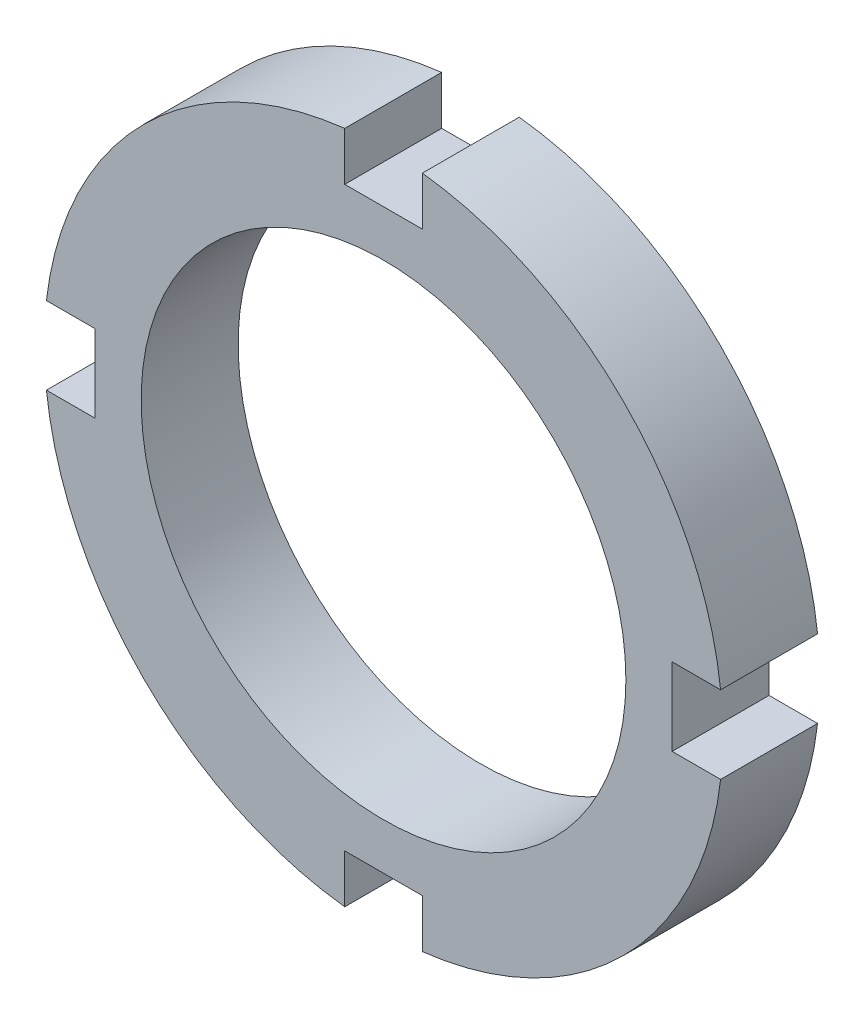
ISO-10303-21;
HEADER;
FILE_DESCRIPTION(('STEP AP214'),'2;1');
FILE_NAME('part.step','',(''),(''),'','','');
FILE_SCHEMA(('AUTOMOTIVE_DESIGN { 1 0 10303 214 1 1 1 1 }'));
ENDSEC;
DATA;
#1=APPLICATION_CONTEXT('core data for automotive mechanical design processes');
#2=APPLICATION_PROTOCOL_DEFINITION('international standard','automotive_design',2000,#1);
#3=PRODUCT_CONTEXT('',#1,'mechanical');
#4=PRODUCT('Part','Part','',(#3));
#5=PRODUCT_RELATED_PRODUCT_CATEGORY('part','',(#4));
#6=PRODUCT_DEFINITION_FORMATION('','',#4);
#7=PRODUCT_DEFINITION_CONTEXT('part definition',#1,'design');
#8=PRODUCT_DEFINITION('design','',#6,#7);
#9=PRODUCT_DEFINITION_SHAPE('','',#8);
#10=(LENGTH_UNIT() NAMED_UNIT(*) SI_UNIT(.MILLI.,.METRE.));
#11=(NAMED_UNIT(*) PLANE_ANGLE_UNIT() SI_UNIT($,.RADIAN.));
#12=(NAMED_UNIT(*) SI_UNIT($,.STERADIAN.) SOLID_ANGLE_UNIT());
#13=UNCERTAINTY_MEASURE_WITH_UNIT(LENGTH_MEASURE(1.E-05),#10,'distance_accuracy_value','');
#14=(GEOMETRIC_REPRESENTATION_CONTEXT(3) GLOBAL_UNCERTAINTY_ASSIGNED_CONTEXT((#13)) GLOBAL_UNIT_ASSIGNED_CONTEXT((#10,
#11,#12)) REPRESENTATION_CONTEXT('',''));
#15=CARTESIAN_POINT('',(0.,0.,0.));
#16=DIRECTION('',(0.,0.,1.));
#17=DIRECTION('',(1.,0.,0.));
#18=AXIS2_PLACEMENT_3D('',#15,#16,#17);
#19=CARTESIAN_POINT('',(0.,0.,5.));
#20=DIRECTION('',(0.,0.,1.));
#21=DIRECTION('',(1.,0.,0.));
#22=AXIS2_PLACEMENT_3D('',#19,#20,#21);
#23=PLANE('',#22);
#24=CARTESIAN_POINT('',(0.,0.,5.));
#25=DIRECTION('',(0.,0.,1.));
#26=DIRECTION('',(1.,0.,0.));
#27=AXIS2_PLACEMENT_3D('',#24,#25,#26);
#28=CIRCLE('',#27,17.5);
#29=CARTESIAN_POINT('',(17.3853386507137,1.99999999999994,5.));
#30=VERTEX_POINT('',#29);
#31=CARTESIAN_POINT('',(2.,17.3853386507137,5.));
#32=VERTEX_POINT('',#31);
#33=EDGE_CURVE('E239',#30,#32,#28,.T.);
#34=ORIENTED_EDGE('',*,*,#33,.T.);
#35=DIRECTION('',(0.,-1.,0.));
#36=VECTOR('',#35,1.);
#37=CARTESIAN_POINT('',(2.,17.3853386507137,5.));
#38=LINE('',#37,#36);
#39=CARTESIAN_POINT('',(2.,14.8853386507137,5.));
#40=VERTEX_POINT('',#39);
#41=EDGE_CURVE('E126',#32,#40,#38,.T.);
#42=ORIENTED_EDGE('',*,*,#41,.T.);
#43=DIRECTION('',(-1.,0.,0.));
#44=VECTOR('',#43,1.);
#45=CARTESIAN_POINT('',(2.,14.8853386507137,5.));
#46=LINE('',#45,#44);
#47=CARTESIAN_POINT('',(-2.,14.8853386507137,5.));
#48=VERTEX_POINT('',#47);
#49=EDGE_CURVE('E293',#40,#48,#46,.T.);
#50=ORIENTED_EDGE('',*,*,#49,.T.);
#51=DIRECTION('',(0.,1.,0.));
#52=VECTOR('',#51,1.);
#53=CARTESIAN_POINT('',(-2.,17.3853386507137,5.));
#54=LINE('',#53,#52);
#55=CARTESIAN_POINT('',(-2.,17.3853386507137,5.));
#56=VERTEX_POINT('',#55);
#57=EDGE_CURVE('E313',#48,#56,#54,.T.);
#58=ORIENTED_EDGE('',*,*,#57,.T.);
#59=CARTESIAN_POINT('',(0.,0.,5.));
#60=DIRECTION('',(0.,0.,1.));
#61=DIRECTION('',(1.,0.,0.));
#62=AXIS2_PLACEMENT_3D('',#59,#60,#61);
#63=CIRCLE('',#62,17.5);
#64=CARTESIAN_POINT('',(-17.3853386507137,2.00000000000018,5.));
#65=VERTEX_POINT('',#64);
#66=EDGE_CURVE('E309',#56,#65,#63,.T.);
#67=ORIENTED_EDGE('',*,*,#66,.T.);
#68=DIRECTION('',(1.,0.,0.));
#69=VECTOR('',#68,1.);
#70=CARTESIAN_POINT('',(-17.3853386507137,2.00000000000018,5.));
#71=LINE('',#70,#69);
#72=CARTESIAN_POINT('',(-14.8853386507137,2.00000000000016,5.));
#73=VERTEX_POINT('',#72);
#74=EDGE_CURVE('E312',#65,#73,#71,.T.);
#75=ORIENTED_EDGE('',*,*,#74,.T.);
#76=DIRECTION('',(0.,-1.,0.));
#77=VECTOR('',#76,1.);
#78=CARTESIAN_POINT('',(-14.8853386507137,2.00000000000016,5.));
#79=LINE('',#78,#77);
#80=CARTESIAN_POINT('',(-14.8853386507137,-1.99999999999984,5.));
#81=VERTEX_POINT('',#80);
#82=EDGE_CURVE('E318',#73,#81,#79,.T.);
#83=ORIENTED_EDGE('',*,*,#82,.T.);
#84=DIRECTION('',(-1.,0.,0.));
#85=VECTOR('',#84,1.);
#86=CARTESIAN_POINT('',(-17.3853386507137,-1.99999999999982,5.));
#87=LINE('',#86,#85);
#88=CARTESIAN_POINT('',(-17.3853386507137,-1.99999999999982,5.));
#89=VERTEX_POINT('',#88);
#90=EDGE_CURVE('E325',#81,#89,#87,.T.);
#91=ORIENTED_EDGE('',*,*,#90,.T.);
#92=CARTESIAN_POINT('',(0.,0.,5.));
#93=DIRECTION('',(0.,0.,1.));
#94=DIRECTION('',(1.,0.,0.));
#95=AXIS2_PLACEMENT_3D('',#92,#93,#94);
#96=CIRCLE('',#95,17.5);
#97=CARTESIAN_POINT('',(-2.00000000000013,-17.3853386507137,5.));
#98=VERTEX_POINT('',#97);
#99=EDGE_CURVE('E328',#89,#98,#96,.T.);
#100=ORIENTED_EDGE('',*,*,#99,.T.);
#101=DIRECTION('',(0.,1.,0.));
#102=VECTOR('',#101,1.);
#103=CARTESIAN_POINT('',(-2.00000000000012,-17.3853386507137,5.));
#104=LINE('',#103,#102);
#105=CARTESIAN_POINT('',(-2.0000000000001,-14.8853386507137,5.));
#106=VERTEX_POINT('',#105);
#107=EDGE_CURVE('E331',#98,#106,#104,.T.);
#108=ORIENTED_EDGE('',*,*,#107,.T.);
#109=DIRECTION('',(1.,0.,0.));
#110=VECTOR('',#109,1.);
#111=CARTESIAN_POINT('',(-2.0000000000001,-14.8853386507137,5.));
#112=LINE('',#111,#110);
#113=CARTESIAN_POINT('',(1.9999999999999,-14.8853386507137,5.));
#114=VERTEX_POINT('',#113);
#115=EDGE_CURVE('E334',#106,#114,#112,.T.);
#116=ORIENTED_EDGE('',*,*,#115,.T.);
#117=DIRECTION('',(0.,-1.,0.));
#118=VECTOR('',#117,1.);
#119=CARTESIAN_POINT('',(1.99999999999988,-17.3853386507137,5.));
#120=LINE('',#119,#118);
#121=CARTESIAN_POINT('',(1.99999999999988,-17.3853386507137,5.));
#122=VERTEX_POINT('',#121);
#123=EDGE_CURVE('E337',#114,#122,#120,.T.);
#124=ORIENTED_EDGE('',*,*,#123,.T.);
#125=CARTESIAN_POINT('',(0.,0.,5.));
#126=DIRECTION('',(0.,0.,1.));
#127=DIRECTION('',(1.,0.,0.));
#128=AXIS2_PLACEMENT_3D('',#125,#126,#127);
#129=CIRCLE('',#128,17.5);
#130=CARTESIAN_POINT('',(17.3853386507137,-2.00000000000007,5.));
#131=VERTEX_POINT('',#130);
#132=EDGE_CURVE('E169',#122,#131,#129,.T.);
#133=ORIENTED_EDGE('',*,*,#132,.T.);
#134=DIRECTION('',(-1.,0.,0.));
#135=VECTOR('',#134,1.);
#136=CARTESIAN_POINT('',(17.3853386507137,-2.00000000000006,5.));
#137=LINE('',#136,#135);
#138=CARTESIAN_POINT('',(14.8853386507137,-2.00000000000005,5.));
#139=VERTEX_POINT('',#138);
#140=EDGE_CURVE('E163',#131,#139,#137,.T.);
#141=ORIENTED_EDGE('',*,*,#140,.T.);
#142=DIRECTION('',(0.,1.,0.));
#143=VECTOR('',#142,1.);
#144=CARTESIAN_POINT('',(14.8853386507137,-2.00000000000005,5.));
#145=LINE('',#144,#143);
#146=CARTESIAN_POINT('',(14.8853386507137,1.99999999999995,5.));
#147=VERTEX_POINT('',#146);
#148=EDGE_CURVE('E167',#139,#147,#145,.T.);
#149=ORIENTED_EDGE('',*,*,#148,.T.);
#150=DIRECTION('',(1.,0.,0.));
#151=VECTOR('',#150,1.);
#152=CARTESIAN_POINT('',(17.3853386507137,1.99999999999994,5.));
#153=LINE('',#152,#151);
#154=EDGE_CURVE('E59',#147,#30,#153,.T.);
#155=ORIENTED_EDGE('',*,*,#154,.T.);
#156=EDGE_LOOP('',(#34,#42,#50,#58,#67,#75,#83,#91,#100,#108,#116,#124,#133,#141,#149,#155));
#157=FACE_BOUND('',#156,.T.);
#158=CARTESIAN_POINT('',(0.,0.,5.));
#159=DIRECTION('',(0.,0.,1.));
#160=DIRECTION('',(1.,0.,0.));
#161=AXIS2_PLACEMENT_3D('',#158,#159,#160);
#162=CIRCLE('',#161,12.5);
#163=CARTESIAN_POINT('',(12.5,0.,5.));
#164=VERTEX_POINT('',#163);
#165=EDGE_CURVE('E197',#164,#164,#162,.T.);
#166=ORIENTED_EDGE('',*,*,#165,.F.);
#167=EDGE_LOOP('',(#166));
#168=FACE_BOUND('',#167,.T.);
#169=ADVANCED_FACE('F41',(#157,#168),#23,.T.);
#170=CARTESIAN_POINT('',(0.,0.,0.));
#171=DIRECTION('',(0.,0.,1.));
#172=DIRECTION('',(1.,0.,0.));
#173=AXIS2_PLACEMENT_3D('',#170,#171,#172);
#174=PLANE('',#173);
#175=CARTESIAN_POINT('',(0.,0.,0.));
#176=DIRECTION('',(0.,0.,1.));
#177=DIRECTION('',(1.,0.,0.));
#178=AXIS2_PLACEMENT_3D('',#175,#176,#177);
#179=CIRCLE('',#178,17.5);
#180=CARTESIAN_POINT('',(17.3853386507137,1.99999999999994,0.));
#181=VERTEX_POINT('',#180);
#182=CARTESIAN_POINT('',(2.,17.3853386507137,0.));
#183=VERTEX_POINT('',#182);
#184=EDGE_CURVE('E192',#181,#183,#179,.T.);
#185=ORIENTED_EDGE('',*,*,#184,.F.);
#186=DIRECTION('',(1.,0.,0.));
#187=VECTOR('',#186,1.);
#188=CARTESIAN_POINT('',(17.3853386507137,1.99999999999994,0.));
#189=LINE('',#188,#187);
#190=CARTESIAN_POINT('',(14.8853386507137,1.99999999999995,0.));
#191=VERTEX_POINT('',#190);
#192=EDGE_CURVE('E118',#191,#181,#189,.T.);
#193=ORIENTED_EDGE('',*,*,#192,.F.);
#194=DIRECTION('',(0.,1.,0.));
#195=VECTOR('',#194,1.);
#196=CARTESIAN_POINT('',(14.8853386507137,-2.00000000000005,0.));
#197=LINE('',#196,#195);
#198=CARTESIAN_POINT('',(14.8853386507137,-2.00000000000005,0.));
#199=VERTEX_POINT('',#198);
#200=EDGE_CURVE('E112',#199,#191,#197,.T.);
#201=ORIENTED_EDGE('',*,*,#200,.F.);
#202=DIRECTION('',(-1.,0.,0.));
#203=VECTOR('',#202,1.);
#204=CARTESIAN_POINT('',(17.3853386507137,-2.00000000000006,0.));
#205=LINE('',#204,#203);
#206=CARTESIAN_POINT('',(17.3853386507137,-2.00000000000007,0.));
#207=VERTEX_POINT('',#206);
#208=EDGE_CURVE('E178',#207,#199,#205,.T.);
#209=ORIENTED_EDGE('',*,*,#208,.F.);
#210=CARTESIAN_POINT('',(0.,0.,0.));
#211=DIRECTION('',(0.,0.,1.));
#212=DIRECTION('',(1.,0.,0.));
#213=AXIS2_PLACEMENT_3D('',#210,#211,#212);
#214=CIRCLE('',#213,17.5);
#215=CARTESIAN_POINT('',(1.99999999999988,-17.3853386507137,0.));
#216=VERTEX_POINT('',#215);
#217=EDGE_CURVE('E230',#216,#207,#214,.T.);
#218=ORIENTED_EDGE('',*,*,#217,.F.);
#219=DIRECTION('',(0.,-1.,0.));
#220=VECTOR('',#219,1.);
#221=CARTESIAN_POINT('',(1.99999999999988,-17.3853386507137,0.));
#222=LINE('',#221,#220);
#223=CARTESIAN_POINT('',(1.9999999999999,-14.8853386507137,0.));
#224=VERTEX_POINT('',#223);
#225=EDGE_CURVE('E227',#224,#216,#222,.T.);
#226=ORIENTED_EDGE('',*,*,#225,.F.);
#227=DIRECTION('',(1.,0.,0.));
#228=VECTOR('',#227,1.);
#229=CARTESIAN_POINT('',(-2.0000000000001,-14.8853386507137,0.));
#230=LINE('',#229,#228);
#231=CARTESIAN_POINT('',(-2.0000000000001,-14.8853386507137,0.));
#232=VERTEX_POINT('',#231);
#233=EDGE_CURVE('E224',#232,#224,#230,.T.);
#234=ORIENTED_EDGE('',*,*,#233,.F.);
#235=DIRECTION('',(0.,1.,0.));
#236=VECTOR('',#235,1.);
#237=CARTESIAN_POINT('',(-2.00000000000012,-17.3853386507137,0.));
#238=LINE('',#237,#236);
#239=CARTESIAN_POINT('',(-2.00000000000013,-17.3853386507137,0.));
#240=VERTEX_POINT('',#239);
#241=EDGE_CURVE('E221',#240,#232,#238,.T.);
#242=ORIENTED_EDGE('',*,*,#241,.F.);
#243=CARTESIAN_POINT('',(0.,0.,0.));
#244=DIRECTION('',(0.,0.,1.));
#245=DIRECTION('',(1.,0.,0.));
#246=AXIS2_PLACEMENT_3D('',#243,#244,#245);
#247=CIRCLE('',#246,17.5);
#248=CARTESIAN_POINT('',(-17.3853386507137,-1.99999999999982,0.));
#249=VERTEX_POINT('',#248);
#250=EDGE_CURVE('E218',#249,#240,#247,.T.);
#251=ORIENTED_EDGE('',*,*,#250,.F.);
#252=DIRECTION('',(-1.,0.,0.));
#253=VECTOR('',#252,1.);
#254=CARTESIAN_POINT('',(-17.3853386507137,-1.99999999999982,0.));
#255=LINE('',#254,#253);
#256=CARTESIAN_POINT('',(-14.8853386507137,-1.99999999999984,0.));
#257=VERTEX_POINT('',#256);
#258=EDGE_CURVE('E215',#257,#249,#255,.T.);
#259=ORIENTED_EDGE('',*,*,#258,.F.);
#260=DIRECTION('',(0.,-1.,0.));
#261=VECTOR('',#260,1.);
#262=CARTESIAN_POINT('',(-14.8853386507137,2.00000000000016,0.));
#263=LINE('',#262,#261);
#264=CARTESIAN_POINT('',(-14.8853386507137,2.00000000000016,0.));
#265=VERTEX_POINT('',#264);
#266=EDGE_CURVE('E212',#265,#257,#263,.T.);
#267=ORIENTED_EDGE('',*,*,#266,.F.);
#268=DIRECTION('',(1.,0.,0.));
#269=VECTOR('',#268,1.);
#270=CARTESIAN_POINT('',(-17.3853386507137,2.00000000000018,0.));
#271=LINE('',#270,#269);
#272=CARTESIAN_POINT('',(-17.3853386507137,2.00000000000018,0.));
#273=VERTEX_POINT('',#272);
#274=EDGE_CURVE('E209',#273,#265,#271,.T.);
#275=ORIENTED_EDGE('',*,*,#274,.F.);
#276=CARTESIAN_POINT('',(0.,0.,0.));
#277=DIRECTION('',(0.,0.,1.));
#278=DIRECTION('',(1.,0.,0.));
#279=AXIS2_PLACEMENT_3D('',#276,#277,#278);
#280=CIRCLE('',#279,17.5);
#281=CARTESIAN_POINT('',(-2.,17.3853386507137,0.));
#282=VERTEX_POINT('',#281);
#283=EDGE_CURVE('E206',#282,#273,#280,.T.);
#284=ORIENTED_EDGE('',*,*,#283,.F.);
#285=DIRECTION('',(0.,1.,0.));
#286=VECTOR('',#285,1.);
#287=CARTESIAN_POINT('',(-2.,17.3853386507137,0.));
#288=LINE('',#287,#286);
#289=CARTESIAN_POINT('',(-2.,14.8853386507137,0.));
#290=VERTEX_POINT('',#289);
#291=EDGE_CURVE('E203',#290,#282,#288,.T.);
#292=ORIENTED_EDGE('',*,*,#291,.F.);
#293=DIRECTION('',(-1.,0.,0.));
#294=VECTOR('',#293,1.);
#295=CARTESIAN_POINT('',(2.,14.8853386507137,0.));
#296=LINE('',#295,#294);
#297=CARTESIAN_POINT('',(2.,14.8853386507137,0.));
#298=VERTEX_POINT('',#297);
#299=EDGE_CURVE('E200',#298,#290,#296,.T.);
#300=ORIENTED_EDGE('',*,*,#299,.F.);
#301=DIRECTION('',(0.,-1.,0.));
#302=VECTOR('',#301,1.);
#303=CARTESIAN_POINT('',(2.,17.3853386507137,0.));
#304=LINE('',#303,#302);
#305=EDGE_CURVE('E196',#183,#298,#304,.T.);
#306=ORIENTED_EDGE('',*,*,#305,.F.);
#307=EDGE_LOOP('',(#185,#193,#201,#209,#218,#226,#234,#242,#251,#259,#267,#275,#284,#292,#300,#306));
#308=FACE_BOUND('',#307,.T.);
#309=CARTESIAN_POINT('',(0.,0.,0.));
#310=DIRECTION('',(0.,0.,1.));
#311=DIRECTION('',(1.,0.,0.));
#312=AXIS2_PLACEMENT_3D('',#309,#310,#311);
#313=CIRCLE('',#312,12.5);
#314=CARTESIAN_POINT('',(12.5,0.,0.));
#315=VERTEX_POINT('',#314);
#316=EDGE_CURVE('E547',#315,#315,#313,.T.);
#317=ORIENTED_EDGE('',*,*,#316,.T.);
#318=EDGE_LOOP('',(#317));
#319=FACE_BOUND('',#318,.T.);
#320=ADVANCED_FACE('F297',(#308,#319),#174,.F.);
#321=CARTESIAN_POINT('',(0.,0.,5.));
#322=DIRECTION('',(0.,0.,-1.));
#323=DIRECTION('',(-1.,0.,0.));
#324=AXIS2_PLACEMENT_3D('',#321,#322,#323);
#325=CYLINDRICAL_SURFACE('',#324,17.5);
#326=ORIENTED_EDGE('',*,*,#184,.T.);
#327=DIRECTION('',(0.,0.,-1.));
#328=VECTOR('',#327,1.);
#329=CARTESIAN_POINT('',(2.,17.3853386507137,5.));
#330=LINE('',#329,#328);
#331=EDGE_CURVE('E11',#32,#183,#330,.T.);
#332=ORIENTED_EDGE('',*,*,#331,.F.);
#333=ORIENTED_EDGE('',*,*,#33,.F.);
#334=DIRECTION('',(0.,0.,-1.));
#335=VECTOR('',#334,1.);
#336=CARTESIAN_POINT('',(17.3853386507137,1.99999999999994,5.));
#337=LINE('',#336,#335);
#338=EDGE_CURVE('E188',#30,#181,#337,.T.);
#339=ORIENTED_EDGE('',*,*,#338,.T.);
#340=EDGE_LOOP('',(#326,#332,#333,#339));
#341=FACE_BOUND('',#340,.T.);
#342=ADVANCED_FACE('F43',(#341),#325,.T.);
#343=CARTESIAN_POINT('',(2.,17.3853386507137,5.));
#344=DIRECTION('',(1.,0.,0.));
#345=DIRECTION('',(0.,1.,0.));
#346=AXIS2_PLACEMENT_3D('',#343,#344,#345);
#347=PLANE('',#346);
#348=ORIENTED_EDGE('',*,*,#305,.T.);
#349=DIRECTION('',(0.,0.,-1.));
#350=VECTOR('',#349,1.);
#351=CARTESIAN_POINT('',(2.,14.8853386507137,5.));
#352=LINE('',#351,#350);
#353=EDGE_CURVE('E51',#40,#298,#352,.T.);
#354=ORIENTED_EDGE('',*,*,#353,.F.);
#355=ORIENTED_EDGE('',*,*,#41,.F.);
#356=ORIENTED_EDGE('',*,*,#331,.T.);
#357=EDGE_LOOP('',(#348,#354,#355,#356));
#358=FACE_BOUND('',#357,.T.);
#359=ADVANCED_FACE('F382',(#358),#347,.F.);
#360=CARTESIAN_POINT('',(2.,14.8853386507137,5.));
#361=DIRECTION('',(0.,-1.,0.));
#362=DIRECTION('',(0.,0.,-1.));
#363=AXIS2_PLACEMENT_3D('',#360,#361,#362);
#364=PLANE('',#363);
#365=ORIENTED_EDGE('',*,*,#299,.T.);
#366=DIRECTION('',(0.,0.,-1.));
#367=VECTOR('',#366,1.);
#368=CARTESIAN_POINT('',(-2.,14.8853386507137,5.));
#369=LINE('',#368,#367);
#370=EDGE_CURVE('E282',#48,#290,#369,.T.);
#371=ORIENTED_EDGE('',*,*,#370,.F.);
#372=ORIENTED_EDGE('',*,*,#49,.F.);
#373=ORIENTED_EDGE('',*,*,#353,.T.);
#374=EDGE_LOOP('',(#365,#371,#372,#373));
#375=FACE_BOUND('',#374,.T.);
#376=ADVANCED_FACE('F291',(#375),#364,.F.);
#377=CARTESIAN_POINT('',(-2.,17.3853386507137,5.));
#378=DIRECTION('',(-1.,0.,0.));
#379=DIRECTION('',(0.,-1.,0.));
#380=AXIS2_PLACEMENT_3D('',#377,#378,#379);
#381=PLANE('',#380);
#382=ORIENTED_EDGE('',*,*,#291,.T.);
#383=DIRECTION('',(0.,0.,-1.));
#384=VECTOR('',#383,1.);
#385=CARTESIAN_POINT('',(-2.,17.3853386507137,5.));
#386=LINE('',#385,#384);
#387=EDGE_CURVE('E278',#56,#282,#386,.T.);
#388=ORIENTED_EDGE('',*,*,#387,.F.);
#389=ORIENTED_EDGE('',*,*,#57,.F.);
#390=ORIENTED_EDGE('',*,*,#370,.T.);
#391=EDGE_LOOP('',(#382,#388,#389,#390));
#392=FACE_BOUND('',#391,.T.);
#393=ADVANCED_FACE('F303',(#392),#381,.F.);
#394=CARTESIAN_POINT('',(0.,0.,5.));
#395=DIRECTION('',(0.,0.,-1.));
#396=DIRECTION('',(-1.,0.,0.));
#397=AXIS2_PLACEMENT_3D('',#394,#395,#396);
#398=CYLINDRICAL_SURFACE('',#397,17.5);
#399=ORIENTED_EDGE('',*,*,#283,.T.);
#400=DIRECTION('',(0.,0.,-1.));
#401=VECTOR('',#400,1.);
#402=CARTESIAN_POINT('',(-17.3853386507137,2.00000000000018,5.));
#403=LINE('',#402,#401);
#404=EDGE_CURVE('E274',#65,#273,#403,.T.);
#405=ORIENTED_EDGE('',*,*,#404,.F.);
#406=ORIENTED_EDGE('',*,*,#66,.F.);
#407=ORIENTED_EDGE('',*,*,#387,.T.);
#408=EDGE_LOOP('',(#399,#405,#406,#407));
#409=FACE_BOUND('',#408,.T.);
#410=ADVANCED_FACE('F307',(#409),#398,.T.);
#411=CARTESIAN_POINT('',(-17.3853386507137,2.00000000000018,5.));
#412=DIRECTION('',(0.,1.,0.));
#413=DIRECTION('',(-1.,0.,0.));
#414=AXIS2_PLACEMENT_3D('',#411,#412,#413);
#415=PLANE('',#414);
#416=ORIENTED_EDGE('',*,*,#274,.T.);
#417=DIRECTION('',(0.,0.,-1.));
#418=VECTOR('',#417,1.);
#419=CARTESIAN_POINT('',(-14.8853386507137,2.00000000000016,5.));
#420=LINE('',#419,#418);
#421=EDGE_CURVE('E270',#73,#265,#420,.T.);
#422=ORIENTED_EDGE('',*,*,#421,.F.);
#423=ORIENTED_EDGE('',*,*,#74,.F.);
#424=ORIENTED_EDGE('',*,*,#404,.T.);
#425=EDGE_LOOP('',(#416,#422,#423,#424));
#426=FACE_BOUND('',#425,.T.);
#427=ADVANCED_FACE('F395',(#426),#415,.F.);
#428=CARTESIAN_POINT('',(-14.8853386507137,2.00000000000016,5.));
#429=DIRECTION('',(1.,0.,0.));
#430=DIRECTION('',(0.,1.,0.));
#431=AXIS2_PLACEMENT_3D('',#428,#429,#430);
#432=PLANE('',#431);
#433=ORIENTED_EDGE('',*,*,#266,.T.);
#434=DIRECTION('',(0.,0.,-1.));
#435=VECTOR('',#434,1.);
#436=CARTESIAN_POINT('',(-14.8853386507137,-1.99999999999984,5.));
#437=LINE('',#436,#435);
#438=EDGE_CURVE('E266',#81,#257,#437,.T.);
#439=ORIENTED_EDGE('',*,*,#438,.F.);
#440=ORIENTED_EDGE('',*,*,#82,.F.);
#441=ORIENTED_EDGE('',*,*,#421,.T.);
#442=EDGE_LOOP('',(#433,#439,#440,#441));
#443=FACE_BOUND('',#442,.T.);
#444=ADVANCED_FACE('F398',(#443),#432,.F.);
#445=CARTESIAN_POINT('',(-17.3853386507137,-1.99999999999982,5.));
#446=DIRECTION('',(0.,-1.,0.));
#447=DIRECTION('',(1.,0.,0.));
#448=AXIS2_PLACEMENT_3D('',#445,#446,#447);
#449=PLANE('',#448);
#450=ORIENTED_EDGE('',*,*,#258,.T.);
#451=DIRECTION('',(0.,0.,-1.));
#452=VECTOR('',#451,1.);
#453=CARTESIAN_POINT('',(-17.3853386507137,-1.99999999999982,5.));
#454=LINE('',#453,#452);
#455=EDGE_CURVE('E262',#89,#249,#454,.T.);
#456=ORIENTED_EDGE('',*,*,#455,.F.);
#457=ORIENTED_EDGE('',*,*,#90,.F.);
#458=ORIENTED_EDGE('',*,*,#438,.T.);
#459=EDGE_LOOP('',(#450,#456,#457,#458));
#460=FACE_BOUND('',#459,.T.);
#461=ADVANCED_FACE('F402',(#460),#449,.F.);
#462=CARTESIAN_POINT('',(0.,0.,5.));
#463=DIRECTION('',(0.,0.,-1.));
#464=DIRECTION('',(-1.,0.,0.));
#465=AXIS2_PLACEMENT_3D('',#462,#463,#464);
#466=CYLINDRICAL_SURFACE('',#465,17.5);
#467=ORIENTED_EDGE('',*,*,#250,.T.);
#468=DIRECTION('',(0.,0.,-1.));
#469=VECTOR('',#468,1.);
#470=CARTESIAN_POINT('',(-2.00000000000013,-17.3853386507137,5.));
#471=LINE('',#470,#469);
#472=EDGE_CURVE('E258',#98,#240,#471,.T.);
#473=ORIENTED_EDGE('',*,*,#472,.F.);
#474=ORIENTED_EDGE('',*,*,#99,.F.);
#475=ORIENTED_EDGE('',*,*,#455,.T.);
#476=EDGE_LOOP('',(#467,#473,#474,#475));
#477=FACE_BOUND('',#476,.T.);
#478=ADVANCED_FACE('F406',(#477),#466,.T.);
#479=CARTESIAN_POINT('',(-2.00000000000012,-17.3853386507137,5.));
#480=DIRECTION('',(-1.,0.,0.));
#481=DIRECTION('',(0.,-1.,0.));
#482=AXIS2_PLACEMENT_3D('',#479,#480,#481);
#483=PLANE('',#482);
#484=ORIENTED_EDGE('',*,*,#241,.T.);
#485=DIRECTION('',(0.,0.,-1.));
#486=VECTOR('',#485,1.);
#487=CARTESIAN_POINT('',(-2.0000000000001,-14.8853386507137,5.));
#488=LINE('',#487,#486);
#489=EDGE_CURVE('E254',#106,#232,#488,.T.);
#490=ORIENTED_EDGE('',*,*,#489,.F.);
#491=ORIENTED_EDGE('',*,*,#107,.F.);
#492=ORIENTED_EDGE('',*,*,#472,.T.);
#493=EDGE_LOOP('',(#484,#490,#491,#492));
#494=FACE_BOUND('',#493,.T.);
#495=ADVANCED_FACE('F410',(#494),#483,.F.);
#496=CARTESIAN_POINT('',(-2.0000000000001,-14.8853386507137,5.));
#497=DIRECTION('',(0.,1.,0.));
#498=DIRECTION('',(-1.,0.,0.));
#499=AXIS2_PLACEMENT_3D('',#496,#497,#498);
#500=PLANE('',#499);
#501=ORIENTED_EDGE('',*,*,#233,.T.);
#502=DIRECTION('',(0.,0.,-1.));
#503=VECTOR('',#502,1.);
#504=CARTESIAN_POINT('',(1.9999999999999,-14.8853386507137,5.));
#505=LINE('',#504,#503);
#506=EDGE_CURVE('E250',#114,#224,#505,.T.);
#507=ORIENTED_EDGE('',*,*,#506,.F.);
#508=ORIENTED_EDGE('',*,*,#115,.F.);
#509=ORIENTED_EDGE('',*,*,#489,.T.);
#510=EDGE_LOOP('',(#501,#507,#508,#509));
#511=FACE_BOUND('',#510,.T.);
#512=ADVANCED_FACE('F414',(#511),#500,.F.);
#513=CARTESIAN_POINT('',(1.99999999999988,-17.3853386507137,5.));
#514=DIRECTION('',(1.,0.,0.));
#515=DIRECTION('',(0.,1.,0.));
#516=AXIS2_PLACEMENT_3D('',#513,#514,#515);
#517=PLANE('',#516);
#518=ORIENTED_EDGE('',*,*,#225,.T.);
#519=DIRECTION('',(0.,0.,-1.));
#520=VECTOR('',#519,1.);
#521=CARTESIAN_POINT('',(1.99999999999988,-17.3853386507137,5.));
#522=LINE('',#521,#520);
#523=EDGE_CURVE('E246',#122,#216,#522,.T.);
#524=ORIENTED_EDGE('',*,*,#523,.F.);
#525=ORIENTED_EDGE('',*,*,#123,.F.);
#526=ORIENTED_EDGE('',*,*,#506,.T.);
#527=EDGE_LOOP('',(#518,#524,#525,#526));
#528=FACE_BOUND('',#527,.T.);
#529=ADVANCED_FACE('F354',(#528),#517,.F.);
#530=CARTESIAN_POINT('',(0.,0.,5.));
#531=DIRECTION('',(0.,0.,-1.));
#532=DIRECTION('',(-1.,0.,0.));
#533=AXIS2_PLACEMENT_3D('',#530,#531,#532);
#534=CYLINDRICAL_SURFACE('',#533,17.5);
#535=ORIENTED_EDGE('',*,*,#217,.T.);
#536=DIRECTION('',(0.,0.,-1.));
#537=VECTOR('',#536,1.);
#538=CARTESIAN_POINT('',(17.3853386507137,-2.00000000000007,5.));
#539=LINE('',#538,#537);
#540=EDGE_CURVE('E180',#131,#207,#539,.T.);
#541=ORIENTED_EDGE('',*,*,#540,.F.);
#542=ORIENTED_EDGE('',*,*,#132,.F.);
#543=ORIENTED_EDGE('',*,*,#523,.T.);
#544=EDGE_LOOP('',(#535,#541,#542,#543));
#545=FACE_BOUND('',#544,.T.);
#546=ADVANCED_FACE('F358',(#545),#534,.T.);
#547=CARTESIAN_POINT('',(17.3853386507137,-2.00000000000006,5.));
#548=DIRECTION('',(0.,-1.,0.));
#549=DIRECTION('',(1.,0.,0.));
#550=AXIS2_PLACEMENT_3D('',#547,#548,#549);
#551=PLANE('',#550);
#552=ORIENTED_EDGE('',*,*,#208,.T.);
#553=DIRECTION('',(0.,0.,-1.));
#554=VECTOR('',#553,1.);
#555=CARTESIAN_POINT('',(14.8853386507137,-2.00000000000005,5.));
#556=LINE('',#555,#554);
#557=EDGE_CURVE('E175',#139,#199,#556,.T.);
#558=ORIENTED_EDGE('',*,*,#557,.F.);
#559=ORIENTED_EDGE('',*,*,#140,.F.);
#560=ORIENTED_EDGE('',*,*,#540,.T.);
#561=EDGE_LOOP('',(#552,#558,#559,#560));
#562=FACE_BOUND('',#561,.T.);
#563=ADVANCED_FACE('F176',(#562),#551,.F.);
#564=CARTESIAN_POINT('',(14.8853386507137,-2.00000000000005,5.));
#565=DIRECTION('',(-1.,0.,0.));
#566=DIRECTION('',(0.,-1.,0.));
#567=AXIS2_PLACEMENT_3D('',#564,#565,#566);
#568=PLANE('',#567);
#569=ORIENTED_EDGE('',*,*,#200,.T.);
#570=DIRECTION('',(0.,0.,-1.));
#571=VECTOR('',#570,1.);
#572=CARTESIAN_POINT('',(14.8853386507137,1.99999999999995,5.));
#573=LINE('',#572,#571);
#574=EDGE_CURVE('E181',#147,#191,#573,.T.);
#575=ORIENTED_EDGE('',*,*,#574,.F.);
#576=ORIENTED_EDGE('',*,*,#148,.F.);
#577=ORIENTED_EDGE('',*,*,#557,.T.);
#578=EDGE_LOOP('',(#569,#575,#576,#577));
#579=FACE_BOUND('',#578,.T.);
#580=ADVANCED_FACE('F183',(#579),#568,.F.);
#581=CARTESIAN_POINT('',(17.3853386507137,1.99999999999994,5.));
#582=DIRECTION('',(0.,1.,0.));
#583=DIRECTION('',(-1.,0.,0.));
#584=AXIS2_PLACEMENT_3D('',#581,#582,#583);
#585=PLANE('',#584);
#586=ORIENTED_EDGE('',*,*,#192,.T.);
#587=ORIENTED_EDGE('',*,*,#338,.F.);
#588=ORIENTED_EDGE('',*,*,#154,.F.);
#589=ORIENTED_EDGE('',*,*,#574,.T.);
#590=EDGE_LOOP('',(#586,#587,#588,#589));
#591=FACE_BOUND('',#590,.T.);
#592=ADVANCED_FACE('F362',(#591),#585,.F.);
#593=CARTESIAN_POINT('',(0.,0.,5.));
#594=DIRECTION('',(0.,0.,-1.));
#595=DIRECTION('',(-1.,0.,0.));
#596=AXIS2_PLACEMENT_3D('',#593,#594,#595);
#597=CYLINDRICAL_SURFACE('',#596,12.5);
#598=ORIENTED_EDGE('',*,*,#165,.T.);
#599=EDGE_LOOP('',(#598));
#600=FACE_BOUND('',#599,.T.);
#601=ORIENTED_EDGE('',*,*,#316,.F.);
#602=EDGE_LOOP('',(#601));
#603=FACE_BOUND('',#602,.T.);
#604=ADVANCED_FACE('F364',(#600,#603),#597,.F.);
#605=CLOSED_SHELL('',(#169,#320,#342,#359,#376,#393,#410,#427,#444,#461,#478,#495,#512,#529,
#546,#563,#580,#592,#604));
#606=MANIFOLD_SOLID_BREP('B2',#605);
#607=ADVANCED_BREP_SHAPE_REPRESENTATION('',(#18,#606),#14);
#608=SHAPE_DEFINITION_REPRESENTATION(#9,#607);
ENDSEC;
END-ISO-10303-21;
